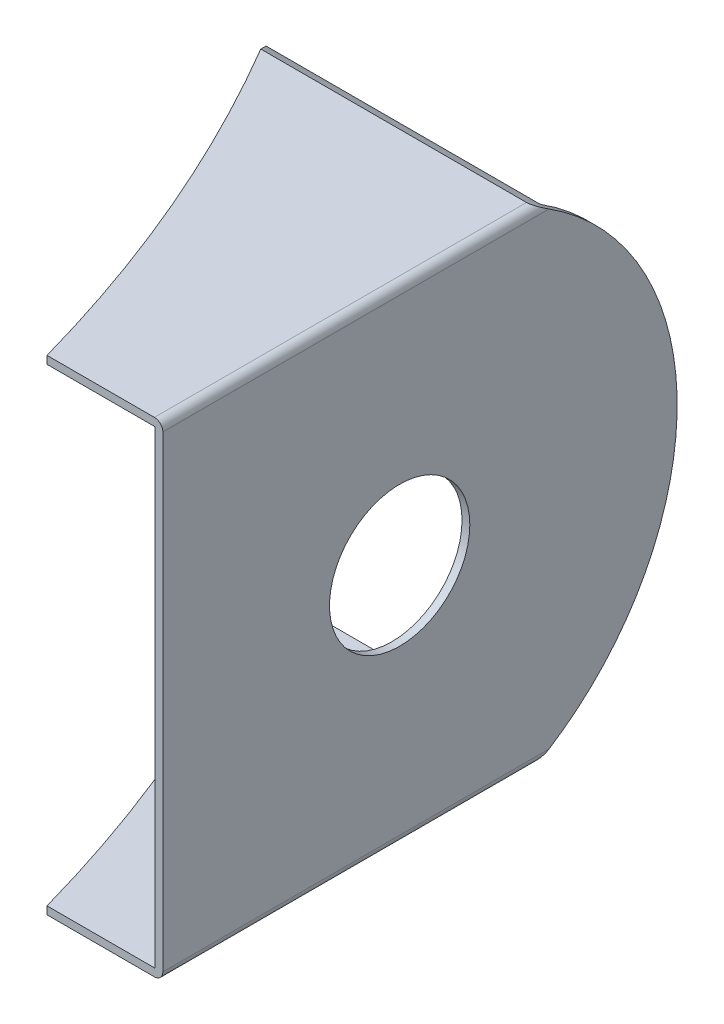
ISO-10303-21;
HEADER;
FILE_DESCRIPTION(('STEP AP214'),'2;1');
FILE_NAME('part.step','',(''),(''),'','','');
FILE_SCHEMA(('AUTOMOTIVE_DESIGN { 1 0 10303 214 1 1 1 1 }'));
ENDSEC;
DATA;
#1=APPLICATION_CONTEXT('core data for automotive mechanical design processes');
#2=APPLICATION_PROTOCOL_DEFINITION('international standard','automotive_design',2000,#1);
#3=PRODUCT_CONTEXT('',#1,'mechanical');
#4=PRODUCT('Part','Part','',(#3));
#5=PRODUCT_RELATED_PRODUCT_CATEGORY('part','',(#4));
#6=PRODUCT_DEFINITION_FORMATION('','',#4);
#7=PRODUCT_DEFINITION_CONTEXT('part definition',#1,'design');
#8=PRODUCT_DEFINITION('design','',#6,#7);
#9=PRODUCT_DEFINITION_SHAPE('','',#8);
#10=(LENGTH_UNIT() NAMED_UNIT(*) SI_UNIT(.MILLI.,.METRE.));
#11=(NAMED_UNIT(*) PLANE_ANGLE_UNIT() SI_UNIT($,.RADIAN.));
#12=(NAMED_UNIT(*) SI_UNIT($,.STERADIAN.) SOLID_ANGLE_UNIT());
#13=UNCERTAINTY_MEASURE_WITH_UNIT(LENGTH_MEASURE(1.E-05),#10,'distance_accuracy_value','');
#14=(GEOMETRIC_REPRESENTATION_CONTEXT(3) GLOBAL_UNCERTAINTY_ASSIGNED_CONTEXT((#13)) GLOBAL_UNIT_ASSIGNED_CONTEXT((#10,
#11,#12)) REPRESENTATION_CONTEXT('',''));
#15=CARTESIAN_POINT('',(0.,0.,0.));
#16=DIRECTION('',(0.,0.,1.));
#17=DIRECTION('',(1.,0.,0.));
#18=AXIS2_PLACEMENT_3D('',#15,#16,#17);
#19=CARTESIAN_POINT('',(-2.5,0.,0.));
#20=DIRECTION('',(-1.,0.,0.));
#21=DIRECTION('',(0.,0.,1.));
#22=AXIS2_PLACEMENT_3D('',#19,#20,#21);
#23=PLANE('',#22);
#24=CARTESIAN_POINT('',(-2.5,0.,-265.));
#25=DIRECTION('',(-1.,0.,0.));
#26=DIRECTION('',(0.,0.,1.));
#27=AXIS2_PLACEMENT_3D('',#24,#25,#26);
#28=CIRCLE('',#27,22.5);
#29=CARTESIAN_POINT('',(-2.5,0.,-242.5));
#30=VERTEX_POINT('',#29);
#31=EDGE_CURVE('E196',#30,#30,#28,.T.);
#32=ORIENTED_EDGE('',*,*,#31,.F.);
#33=EDGE_LOOP('',(#32));
#34=FACE_BOUND('',#33,.T.);
#35=CARTESIAN_POINT('',(-2.5,0.,-265.));
#36=DIRECTION('',(-1.,0.,0.));
#37=DIRECTION('',(0.,0.,1.));
#38=AXIS2_PLACEMENT_3D('',#35,#36,#37);
#39=CIRCLE('',#38,89.);
#40=CARTESIAN_POINT('',(-2.50000000000002,-75.,-312.916594202844));
#41=VERTEX_POINT('',#40);
#42=CARTESIAN_POINT('',(-2.5,75.,-312.916594202844));
#43=VERTEX_POINT('',#42);
#44=EDGE_CURVE('E309',#41,#43,#39,.F.);
#45=ORIENTED_EDGE('',*,*,#44,.F.);
#46=DIRECTION('',(0.,0.,-1.));
#47=VECTOR('',#46,1.);
#48=CARTESIAN_POINT('',(-2.5,-75.,365.));
#49=LINE('',#48,#47);
#50=CARTESIAN_POINT('',(-2.50000000000002,-75.,-189.039471801476));
#51=VERTEX_POINT('',#50);
#52=EDGE_CURVE('E217',#51,#41,#49,.T.);
#53=ORIENTED_EDGE('',*,*,#52,.F.);
#54=DIRECTION('',(0.,-1.,0.));
#55=VECTOR('',#54,1.);
#56=CARTESIAN_POINT('',(-2.5,0.,-189.039471801476));
#57=LINE('',#56,#55);
#58=CARTESIAN_POINT('',(-2.5,75.,-189.039471801476));
#59=VERTEX_POINT('',#58);
#60=EDGE_CURVE('E322',#59,#51,#57,.T.);
#61=ORIENTED_EDGE('',*,*,#60,.F.);
#62=DIRECTION('',(0.,0.,1.));
#63=VECTOR('',#62,1.);
#64=CARTESIAN_POINT('',(-2.5,75.,365.));
#65=LINE('',#64,#63);
#66=EDGE_CURVE('E215',#43,#59,#65,.T.);
#67=ORIENTED_EDGE('',*,*,#66,.F.);
#68=EDGE_LOOP('',(#45,#53,#61,#67));
#69=FACE_BOUND('',#68,.T.);
#70=ADVANCED_FACE('F78',(#34,#69),#23,.T.);
#71=CARTESIAN_POINT('',(0.,0.,0.));
#72=DIRECTION('',(-1.,0.,0.));
#73=DIRECTION('',(0.,0.,1.));
#74=AXIS2_PLACEMENT_3D('',#71,#72,#73);
#75=PLANE('',#74);
#76=CARTESIAN_POINT('',(0.,0.,-265.));
#77=DIRECTION('',(1.,0.,0.));
#78=DIRECTION('',(0.,0.,-1.));
#79=AXIS2_PLACEMENT_3D('',#76,#77,#78);
#80=CIRCLE('',#79,22.5);
#81=CARTESIAN_POINT('',(0.,0.,-287.5));
#82=VERTEX_POINT('',#81);
#83=EDGE_CURVE('E193',#82,#82,#80,.T.);
#84=ORIENTED_EDGE('',*,*,#83,.F.);
#85=EDGE_LOOP('',(#84));
#86=FACE_BOUND('',#85,.T.);
#87=DIRECTION('',(0.,0.,-1.));
#88=VECTOR('',#87,1.);
#89=CARTESIAN_POINT('',(0.,-75.,365.));
#90=LINE('',#89,#88);
#91=CARTESIAN_POINT('',(0.,-75.,-189.039471801476));
#92=VERTEX_POINT('',#91);
#93=CARTESIAN_POINT('',(0.,-75.,-312.916594202844));
#94=VERTEX_POINT('',#93);
#95=EDGE_CURVE('E218',#92,#94,#90,.T.);
#96=ORIENTED_EDGE('',*,*,#95,.T.);
#97=CARTESIAN_POINT('',(0.,0.,-265.));
#98=DIRECTION('',(-1.,0.,0.));
#99=DIRECTION('',(0.,0.,1.));
#100=AXIS2_PLACEMENT_3D('',#97,#98,#99);
#101=CIRCLE('',#100,89.);
#102=CARTESIAN_POINT('',(0.,75.,-312.916594202844));
#103=VERTEX_POINT('',#102);
#104=EDGE_CURVE('E226',#94,#103,#101,.F.);
#105=ORIENTED_EDGE('',*,*,#104,.T.);
#106=DIRECTION('',(0.,0.,1.));
#107=VECTOR('',#106,1.);
#108=CARTESIAN_POINT('',(0.,75.,365.));
#109=LINE('',#108,#107);
#110=CARTESIAN_POINT('',(0.,75.,-189.039471801476));
#111=VERTEX_POINT('',#110);
#112=EDGE_CURVE('E212',#103,#111,#109,.T.);
#113=ORIENTED_EDGE('',*,*,#112,.T.);
#114=DIRECTION('',(0.,-1.,0.));
#115=VECTOR('',#114,1.);
#116=CARTESIAN_POINT('',(0.,0.,-189.039471801476));
#117=LINE('',#116,#115);
#118=EDGE_CURVE('E198',#111,#92,#117,.T.);
#119=ORIENTED_EDGE('',*,*,#118,.T.);
#120=EDGE_LOOP('',(#96,#105,#113,#119));
#121=FACE_BOUND('',#120,.T.);
#122=ADVANCED_FACE('F80',(#86,#121),#75,.F.);
#123=CARTESIAN_POINT('',(-2.69999999999999,75.,-365.));
#124=DIRECTION('',(0.,0.,-1.));
#125=DIRECTION('',(0.,1.,0.));
#126=AXIS2_PLACEMENT_3D('',#123,#124,#125);
#127=CYLINDRICAL_SURFACE('',#126,2.70000000000001);
#128=CARTESIAN_POINT('',(-2.69999999999999,77.7,-308.401728076195));
#129=CARTESIAN_POINT('',(-2.65984174106869,77.7000054761132,-308.401717883849));
#130=CARTESIAN_POINT('',(-2.61970528145281,77.6991034412853,-308.403333172818));
#131=CARTESIAN_POINT('',(-2.53980520822543,77.6955387905893,-308.409714035789));
#132=CARTESIAN_POINT('',(-2.50004123564936,77.6928780963616,-308.414476171313));
#133=CARTESIAN_POINT('',(-2.38257877020894,77.6824174794397,-308.433192660789));
#134=CARTESIAN_POINT('',(-2.30577201693635,77.6721362371867,-308.451582221636));
#135=CARTESIAN_POINT('',(-2.13840998950569,77.6426315917734,-308.504285477607));
#136=CARTESIAN_POINT('',(-2.04902879567057,77.6218457699448,-308.541376779199));
#137=CARTESIAN_POINT('',(-1.87803547909733,77.5733886538341,-308.627649900219));
#138=CARTESIAN_POINT('',(-1.79646143216919,77.5456857783308,-308.676887161744));
#139=CARTESIAN_POINT('',(-1.59701187561457,77.4679108816823,-308.814746794419));
#140=CARTESIAN_POINT('',(-1.48508364540555,77.4141112449715,-308.9097812655));
#141=CARTESIAN_POINT('',(-1.27860490111391,77.2986227828171,-309.112772265397));
#142=CARTESIAN_POINT('',(-1.18409022644411,77.2369181204062,-309.220754705645));
#143=CARTESIAN_POINT('',(-1.01593601718424,77.1128214081418,-309.436777347634));
#144=CARTESIAN_POINT('',(-0.941283618400169,77.0507984876956,-309.544253999978));
#145=CARTESIAN_POINT('',(-0.802703646059008,76.9233141028206,-309.764047137146));
#146=CARTESIAN_POINT('',(-0.738785133111528,76.8578497940606,-309.876367611201));
#147=CARTESIAN_POINT('',(-0.620156558505752,76.7240279015436,-310.104779546486));
#148=CARTESIAN_POINT('',(-0.565483953343075,76.6556598897692,-310.220884176106));
#149=CARTESIAN_POINT('',(-0.464656302995641,76.5167722720493,-310.455496572402));
#150=CARTESIAN_POINT('',(-0.418503814466675,76.4462520276506,-310.574005048607));
#151=CARTESIAN_POINT('',(-0.311470271773249,76.2653583754462,-310.87636130187));
#152=CARTESIAN_POINT('',(-0.255853419959815,76.153780447872,-311.061362462463));
#153=CARTESIAN_POINT('',(-0.161279447431648,75.9273334662262,-311.433690328185));
#154=CARTESIAN_POINT('',(-0.122333637112966,75.8124622340254,-311.621018523692));
#155=CARTESIAN_POINT('',(-0.0608930546610879,75.5822711688357,-311.99326839316));
#156=CARTESIAN_POINT('',(-0.0381096888427259,75.4669981949599,-312.178171199399));
#157=CARTESIAN_POINT('',(-0.0152806223880787,75.2927502461648,-312.455386101439));
#158=CARTESIAN_POINT('',(-0.00956196895024384,75.2344821123025,-312.547708999312));
#159=CARTESIAN_POINT('',(-0.00192392878167082,75.1175346055044,-312.732252529271));
#160=CARTESIAN_POINT('',(-4.57947227559795E-06,75.0588552285237,-312.82447316034));
#161=CARTESIAN_POINT('',(0.,75.,-312.916594202844));
#162=B_SPLINE_CURVE_WITH_KNOTS('',3,(#128,#129,#130,#131,#132,#133,#134,#135,#136,#137,#138,
#139,#140,#141,#142,#143,#144,#145,#146,#147,#148,#149,#150,#151,#152,#153,#154,#155,#156,#157,
#158,#159,#160,#161),.UNSPECIFIED.,.F.,.F.,(4,2,2,2,2,2,2,2,2,2,2,2,2,2,2,2,4),(0.,
0.120392027188311,0.240652722191132,0.478401767589202,0.773717648538552,1.07040733153265,
1.53691788742706,2.0043781125079,2.43819289647311,2.87237204814082,3.30827004349671,
3.74429862815152,4.41276982819332,5.08169383358017,5.73835060599415,6.06626088806534,
6.39417439988116),.UNSPECIFIED.);
#163=CARTESIAN_POINT('',(-2.69999999999999,77.7,-308.401728076195));
#164=VERTEX_POINT('',#163);
#165=EDGE_CURVE('E240',#164,#103,#162,.T.);
#166=ORIENTED_EDGE('',*,*,#165,.F.);
#167=DIRECTION('',(0.,0.,-1.));
#168=VECTOR('',#167,1.);
#169=CARTESIAN_POINT('',(-2.69999999999999,77.7,0.));
#170=LINE('',#169,#168);
#171=CARTESIAN_POINT('',(-2.69999999999999,77.7,-189.039471801476));
#172=VERTEX_POINT('',#171);
#173=EDGE_CURVE('E210',#172,#164,#170,.T.);
#174=ORIENTED_EDGE('',*,*,#173,.F.);
#175=CARTESIAN_POINT('',(-2.69999999999999,75.,-189.039471801476));
#176=DIRECTION('',(0.,0.,-1.));
#177=DIRECTION('',(-1.,0.,0.));
#178=AXIS2_PLACEMENT_3D('',#175,#176,#177);
#179=CIRCLE('',#178,2.70000000000001);
#180=EDGE_CURVE('E192',#111,#172,#179,.F.);
#181=ORIENTED_EDGE('',*,*,#180,.F.);
#182=ORIENTED_EDGE('',*,*,#112,.F.);
#183=EDGE_LOOP('',(#166,#174,#181,#182));
#184=FACE_BOUND('',#183,.T.);
#185=ADVANCED_FACE('F287',(#184),#127,.T.);
#186=CARTESIAN_POINT('',(-2.69999999999999,75.,-365.));
#187=DIRECTION('',(0.,0.,-1.));
#188=DIRECTION('',(0.,1.,0.));
#189=AXIS2_PLACEMENT_3D('',#186,#187,#188);
#190=CYLINDRICAL_SURFACE('',#189,0.200000000000006);
#191=DIRECTION('',(0.,0.,1.));
#192=VECTOR('',#191,1.);
#193=CARTESIAN_POINT('',(-2.70000000000001,75.2,365.));
#194=LINE('',#193,#192);
#195=CARTESIAN_POINT('',(-2.7,75.2,-189.039471801476));
#196=VERTEX_POINT('',#195);
#197=CARTESIAN_POINT('',(-2.69999999999999,75.2,-312.602100793978));
#198=VERTEX_POINT('',#197);
#199=EDGE_CURVE('E208',#196,#198,#194,.F.);
#200=ORIENTED_EDGE('',*,*,#199,.T.);
#201=CARTESIAN_POINT('',(-2.69999999999999,75.2,-312.602100793978));
#202=CARTESIAN_POINT('',(-2.69356074440797,75.2000081597546,-312.602087868224));
#203=CARTESIAN_POINT('',(-2.68714055642431,75.1996894485544,-312.602591392653));
#204=CARTESIAN_POINT('',(-2.67455867211747,75.1984726704153,-312.604513548254));
#205=CARTESIAN_POINT('',(-2.66839503066849,75.1975804389451,-312.605922962146));
#206=CARTESIAN_POINT('',(-2.65507803315628,75.1950333782778,-312.60994603715));
#207=CARTESIAN_POINT('',(-2.64800964799402,75.1932530330245,-312.61275788283));
#208=CARTESIAN_POINT('',(-2.63449025806675,75.1890998537107,-312.619316232223));
#209=CARTESIAN_POINT('',(-2.62804191392264,75.1867246113549,-312.623066534994));
#210=CARTESIAN_POINT('',(-2.61271343341617,75.180225706199,-312.633325679449));
#211=CARTESIAN_POINT('',(-2.60424696089279,75.1758243962924,-312.640271859968));
#212=CARTESIAN_POINT('',(-2.58865954876164,75.1663923286703,-312.65515232309));
#213=CARTESIAN_POINT('',(-2.58154112879144,75.1613604209051,-312.663088410904));
#214=CARTESIAN_POINT('',(-2.56358560665339,75.1469889522152,-312.685745663265));
#215=CARTESIAN_POINT('',(-2.55392106470705,75.1372293574547,-312.701122776083));
#216=CARTESIAN_POINT('',(-2.53729377265146,75.1170376674919,-312.732913295105));
#217=CARTESIAN_POINT('',(-2.53034477498696,75.1066024533928,-312.749331498938));
#218=CARTESIAN_POINT('',(-2.52025623972902,75.088155668948,-312.778332866958));
#219=CARTESIAN_POINT('',(-2.51659556886052,75.0802265551514,-312.790792020566));
#220=CARTESIAN_POINT('',(-2.51040050699822,75.0642313029192,-312.815911585961));
#221=CARTESIAN_POINT('',(-2.50786689376081,75.0561650738365,-312.828572130503));
#222=CARTESIAN_POINT('',(-2.50388851599764,75.040095804099,-312.853779797852));
#223=CARTESIAN_POINT('',(-2.50242523105904,75.0320941813387,-312.86632494786));
#224=CARTESIAN_POINT('',(-2.50048416425696,75.0160623709561,-312.891446095826));
#225=CARTESIAN_POINT('',(-2.50000485825316,75.00803224684,-312.904022015821));
#226=CARTESIAN_POINT('',(-2.49999999999999,75.,-312.916594202844));
#227=B_SPLINE_CURVE_WITH_KNOTS('',3,(#201,#202,#203,#204,#205,#206,#207,#208,#209,#210,#211,
#212,#213,#214,#215,#216,#217,#218,#219,#220,#221,#222,#223,#224,#225,#226),.UNSPECIFIED.,.F.,
.F.,(4,2,2,2,2,2,2,2,2,2,2,2,4),(0.,0.0192593530396677,0.0383257824187712,0.0616349667844509,
0.0850400825910045,0.120248878276495,0.155522846677881,0.217035299640851,0.278855356017721,
0.324455511713961,0.370087086392449,0.414909084578551,0.459661602905175),.UNSPECIFIED.);
#228=EDGE_CURVE('E274',#198,#43,#227,.T.);
#229=ORIENTED_EDGE('',*,*,#228,.T.);
#230=ORIENTED_EDGE('',*,*,#66,.T.);
#231=CARTESIAN_POINT('',(-2.69999999999999,75.,-189.039471801476));
#232=DIRECTION('',(0.,0.,-1.));
#233=DIRECTION('',(-1.,0.,0.));
#234=AXIS2_PLACEMENT_3D('',#231,#232,#233);
#235=CIRCLE('',#234,0.200000000000006);
#236=EDGE_CURVE('E325',#59,#196,#235,.F.);
#237=ORIENTED_EDGE('',*,*,#236,.T.);
#238=EDGE_LOOP('',(#200,#229,#230,#237));
#239=FACE_BOUND('',#238,.T.);
#240=ADVANCED_FACE('F291',(#239),#190,.F.);
#241=CARTESIAN_POINT('',(2.69957650317733E-13,77.7,0.));
#242=DIRECTION('',(0.,1.,0.));
#243=DIRECTION('',(-1.,0.,0.));
#244=AXIS2_PLACEMENT_3D('',#241,#242,#243);
#245=PLANE('',#244);
#246=CARTESIAN_POINT('',(-520.130598813427,77.7000000000018,-54.000000000002));
#247=DIRECTION('',(0.,1.,0.));
#248=DIRECTION('',(-1.,0.,0.));
#249=AXIS2_PLACEMENT_3D('',#246,#247,#248);
#250=CIRCLE('',#249,501.5);
#251=CARTESIAN_POINT('',(-37.1537970355586,77.7000000000001,-189.039471801476));
#252=VERTEX_POINT('',#251);
#253=CARTESIAN_POINT('',(-87.9477546932022,77.7000000000004,-308.401728076195));
#254=VERTEX_POINT('',#253);
#255=EDGE_CURVE('E106',#252,#254,#250,.T.);
#256=ORIENTED_EDGE('',*,*,#255,.F.);
#257=DIRECTION('',(-1.,0.,0.));
#258=VECTOR('',#257,1.);
#259=CARTESIAN_POINT('',(2.69957650317733E-13,77.7,-189.039471801476));
#260=LINE('',#259,#258);
#261=EDGE_CURVE('E184',#172,#252,#260,.T.);
#262=ORIENTED_EDGE('',*,*,#261,.F.);
#263=ORIENTED_EDGE('',*,*,#173,.T.);
#264=DIRECTION('',(1.,0.,0.));
#265=VECTOR('',#264,1.);
#266=CARTESIAN_POINT('',(-130.,77.7000000000004,-308.401728076195));
#267=LINE('',#266,#265);
#268=EDGE_CURVE('E186',#254,#164,#267,.T.);
#269=ORIENTED_EDGE('',*,*,#268,.F.);
#270=EDGE_LOOP('',(#256,#262,#263,#269));
#271=FACE_BOUND('',#270,.T.);
#272=ADVANCED_FACE('F182',(#271),#245,.T.);
#273=CARTESIAN_POINT('',(2.61228946970625E-13,75.2,0.));
#274=DIRECTION('',(0.,1.,0.));
#275=DIRECTION('',(-1.,0.,0.));
#276=AXIS2_PLACEMENT_3D('',#273,#274,#275);
#277=PLANE('',#276);
#278=DIRECTION('',(-1.,0.,0.));
#279=VECTOR('',#278,1.);
#280=CARTESIAN_POINT('',(2.61228946970625E-13,75.2,-189.039471801476));
#281=LINE('',#280,#279);
#282=CARTESIAN_POINT('',(-37.1537970355586,75.2000000000001,-189.039471801476));
#283=VERTEX_POINT('',#282);
#284=EDGE_CURVE('E330',#196,#283,#281,.T.);
#285=ORIENTED_EDGE('',*,*,#284,.T.);
#286=CARTESIAN_POINT('',(-520.130598813427,75.2000000000018,-54.000000000002));
#287=DIRECTION('',(0.,1.,0.));
#288=DIRECTION('',(-1.,0.,0.));
#289=AXIS2_PLACEMENT_3D('',#286,#287,#288);
#290=CIRCLE('',#289,501.5);
#291=CARTESIAN_POINT('',(-90.4479211721909,75.2000000000004,-312.602100793977));
#292=VERTEX_POINT('',#291);
#293=EDGE_CURVE('E173',#283,#292,#290,.T.);
#294=ORIENTED_EDGE('',*,*,#293,.T.);
#295=DIRECTION('',(1.,0.,0.));
#296=VECTOR('',#295,1.);
#297=CARTESIAN_POINT('',(-130.,75.2000000000004,-312.602100793977));
#298=LINE('',#297,#296);
#299=EDGE_CURVE('E242',#292,#198,#298,.T.);
#300=ORIENTED_EDGE('',*,*,#299,.T.);
#301=ORIENTED_EDGE('',*,*,#199,.F.);
#302=EDGE_LOOP('',(#285,#294,#300,#301));
#303=FACE_BOUND('',#302,.T.);
#304=ADVANCED_FACE('F293',(#303),#277,.F.);
#305=CARTESIAN_POINT('',(-2.70000000000002,-75.,365.));
#306=DIRECTION('',(0.,0.,1.));
#307=DIRECTION('',(0.,-1.,0.));
#308=AXIS2_PLACEMENT_3D('',#305,#306,#307);
#309=CYLINDRICAL_SURFACE('',#308,2.70000000000001);
#310=CARTESIAN_POINT('',(0.,-75.,-312.916594202844));
#311=CARTESIAN_POINT('',(-5.48315406733443E-06,-75.0615534313284,-312.820249925329));
#312=CARTESIAN_POINT('',(-0.00210431795436465,-75.122913952728,-312.723797557342));
#313=CARTESIAN_POINT('',(-0.0104562440630518,-75.2451842713042,-312.530782576569));
#314=CARTESIAN_POINT('',(-0.0167094666221996,-75.3060940541792,-312.434219960396));
#315=CARTESIAN_POINT('',(-0.0416787173237319,-75.488240162083,-312.144222668999));
#316=CARTESIAN_POINT('',(-0.0666041220879811,-75.6086938358383,-311.950790694987));
#317=CARTESIAN_POINT('',(-0.133105592482795,-75.8462911155908,-311.565986057194));
#318=CARTESIAN_POINT('',(-0.174607486245809,-75.9634470106966,-311.374608068388));
#319=CARTESIAN_POINT('',(-0.275186663854188,-76.1942049589935,-310.994482796744));
#320=CARTESIAN_POINT('',(-0.334247367463908,-76.307810253563,-310.805733207225));
#321=CARTESIAN_POINT('',(-0.430480944116539,-76.4635568188196,-310.544835238964));
#322=CARTESIAN_POINT('',(-0.459480841092596,-76.507620544854,-310.470774343927));
#323=CARTESIAN_POINT('',(-0.520769433258584,-76.5949287880894,-310.323550301138));
#324=CARTESIAN_POINT('',(-0.553057851111653,-76.6381733740083,-310.250387078262));
#325=CARTESIAN_POINT('',(-0.655437985567025,-76.7668763192897,-310.031935992275));
#326=CARTESIAN_POINT('',(-0.730844021815753,-76.8509727575857,-309.888241659646));
#327=CARTESIAN_POINT('',(-0.866564745573287,-76.9833798717041,-309.660603317542));
#328=CARTESIAN_POINT('',(-0.92185820430153,-77.033233679171,-309.574548753646));
#329=CARTESIAN_POINT('',(-1.03968524628489,-77.1305406389732,-309.405958594687));
#330=CARTESIAN_POINT('',(-1.10222325104569,-77.1779922995707,-309.323425191153));
#331=CARTESIAN_POINT('',(-1.23510674144134,-77.269484805367,-309.163731030463));
#332=CARTESIAN_POINT('',(-1.3054069686753,-77.3135431191499,-309.086542997064));
#333=CARTESIAN_POINT('',(-1.45511835627923,-77.3974199950886,-308.939123103068));
#334=CARTESIAN_POINT('',(-1.53451386478099,-77.437245620045,-308.868879668609));
#335=CARTESIAN_POINT('',(-1.68909308922567,-77.5047750414191,-308.749442574968));
#336=CARTESIAN_POINT('',(-1.76266730069061,-77.5333865948939,-308.698704452017));
#337=CARTESIAN_POINT('',(-1.91724564234332,-77.5853340005456,-308.606407201778));
#338=CARTESIAN_POINT('',(-1.9982528637253,-77.6086676436716,-308.564851918102));
#339=CARTESIAN_POINT('',(-2.16853832368213,-77.6486316631693,-308.493582556169));
#340=CARTESIAN_POINT('',(-2.2579169402792,-77.665163054478,-308.464043400064));
#341=CARTESIAN_POINT('',(-2.39546994532592,-77.6831717589383,-308.43184279697));
#342=CARTESIAN_POINT('',(-2.44184168031941,-77.6880413985335,-308.423130643608));
#343=CARTESIAN_POINT('',(-2.53536496341074,-77.6953818428264,-308.409995418962));
#344=CARTESIAN_POINT('',(-2.58251587744709,-77.6978545089019,-308.405569019563));
#345=CARTESIAN_POINT('',(-2.65317358667668,-77.6996966159089,-308.402271161887));
#346=CARTESIAN_POINT('',(-2.67658943419555,-77.7000027594894,-308.40172300444));
#347=CARTESIAN_POINT('',(-2.70000000000001,-77.7,-308.401728076195));
#348=B_SPLINE_CURVE_WITH_KNOTS('',3,(#310,#311,#312,#313,#314,#315,#316,#317,#318,#319,#320,
#321,#322,#323,#324,#325,#326,#327,#328,#329,#330,#331,#332,#333,#334,#335,#336,#337,#338,#339,
#340,#341,#342,#343,#344,#345,#346,#347),.UNSPECIFIED.,.F.,.F.,(4,2,2,2,2,2,2,2,2,2,2,2,2,2,2,2,
2,2,4),(0.,0.342941922447976,0.685894680073237,1.37290877849785,2.05688265066433,
2.74021270797353,3.01293409410221,3.28563249933316,3.83305397194942,4.1741856198769,
4.51552657588798,4.85497306730471,5.19384394777077,5.47464815793366,5.75556968112398,
6.04044571129364,6.18252906909512,6.32450200298501,6.39473975055716),.UNSPECIFIED.);
#349=CARTESIAN_POINT('',(-2.70000000000001,-77.7000000000004,-308.401728076195));
#350=VERTEX_POINT('',#349);
#351=EDGE_CURVE('E235',#94,#350,#348,.T.);
#352=ORIENTED_EDGE('',*,*,#351,.F.);
#353=ORIENTED_EDGE('',*,*,#95,.F.);
#354=CARTESIAN_POINT('',(-2.70000000000002,-75.,-189.039471801476));
#355=DIRECTION('',(0.,0.,-1.));
#356=DIRECTION('',(-1.,0.,0.));
#357=AXIS2_PLACEMENT_3D('',#354,#355,#356);
#358=CIRCLE('',#357,2.70000000000001);
#359=CARTESIAN_POINT('',(-2.7,-77.7,-189.039471801476));
#360=VERTEX_POINT('',#359);
#361=EDGE_CURVE('E232',#360,#92,#358,.F.);
#362=ORIENTED_EDGE('',*,*,#361,.F.);
#363=DIRECTION('',(0.,0.,1.));
#364=VECTOR('',#363,1.);
#365=CARTESIAN_POINT('',(-2.7,-77.7,-365.));
#366=LINE('',#365,#364);
#367=EDGE_CURVE('E205',#360,#350,#366,.F.);
#368=ORIENTED_EDGE('',*,*,#367,.T.);
#369=EDGE_LOOP('',(#352,#353,#362,#368));
#370=FACE_BOUND('',#369,.T.);
#371=ADVANCED_FACE('F231',(#370),#309,.T.);
#372=CARTESIAN_POINT('',(-2.70000000000002,-75.,365.));
#373=DIRECTION('',(0.,0.,1.));
#374=DIRECTION('',(0.,-1.,0.));
#375=AXIS2_PLACEMENT_3D('',#372,#373,#374);
#376=CYLINDRICAL_SURFACE('',#375,0.200000000000006);
#377=ORIENTED_EDGE('',*,*,#52,.T.);
#378=CARTESIAN_POINT('',(-2.50000000000002,-75.,-312.916594202844));
#379=CARTESIAN_POINT('',(-2.50000814912922,-75.0090840001549,-312.902375823492));
#380=CARTESIAN_POINT('',(-2.50061950746852,-75.0181663468577,-312.888150968514));
#381=CARTESIAN_POINT('',(-2.50310586748239,-75.0362985743765,-312.859734424288));
#382=CARTESIAN_POINT('',(-2.50498448774922,-75.0453482874082,-312.84554294712));
#383=CARTESIAN_POINT('',(-2.51007460955225,-75.0633738417529,-312.81725829119));
#384=CARTESIAN_POINT('',(-2.51329207384104,-75.0723491670526,-312.803165842635));
#385=CARTESIAN_POINT('',(-2.52117927184258,-75.0900971410082,-312.775282140062));
#386=CARTESIAN_POINT('',(-2.52584695948389,-75.0988700566201,-312.761490490813));
#387=CARTESIAN_POINT('',(-2.53547249033267,-75.1139724922818,-312.737734370018));
#388=CARTESIAN_POINT('',(-2.54007224556964,-75.1203691015468,-312.727667899897));
#389=CARTESIAN_POINT('',(-2.55033486852539,-75.1329138331611,-312.707917535215));
#390=CARTESIAN_POINT('',(-2.55599788639378,-75.1390619202658,-312.698233694922));
#391=CARTESIAN_POINT('',(-2.56860406291956,-75.1510344785914,-312.679368101461));
#392=CARTESIAN_POINT('',(-2.57555693181496,-75.1568560270035,-312.670190891967));
#393=CARTESIAN_POINT('',(-2.59093439630727,-75.1679111215306,-312.652756931437));
#394=CARTESIAN_POINT('',(-2.59935534585359,-75.1731460727819,-312.644497981187));
#395=CARTESIAN_POINT('',(-2.61412385041696,-75.1807299251493,-312.632529600968));
#396=CARTESIAN_POINT('',(-2.61991956374032,-75.18338605653,-312.628336962936));
#397=CARTESIAN_POINT('',(-2.63214561638514,-75.1882525977177,-312.620654047139));
#398=CARTESIAN_POINT('',(-2.63857612406581,-75.190462888804,-312.617163956453));
#399=CARTESIAN_POINT('',(-2.65212699644402,-75.1943152286945,-312.611080333546));
#400=CARTESIAN_POINT('',(-2.65925534298858,-75.1959493961739,-312.60849923676));
#401=CARTESIAN_POINT('',(-2.67396606121457,-75.1984369927653,-312.604569943383));
#402=CARTESIAN_POINT('',(-2.68154657875856,-75.1992934042232,-312.603217037237));
#403=CARTESIAN_POINT('',(-2.69099093581041,-75.1998052488306,-312.602408453007));
#404=CARTESIAN_POINT('',(-2.69279034541177,-75.1998782112942,-312.602293190549));
#405=CARTESIAN_POINT('',(-2.69639289368694,-75.1999755091003,-312.602139484008));
#406=CARTESIAN_POINT('',(-2.69819603016305,-75.1999998677061,-312.602101003174));
#407=CARTESIAN_POINT('',(-2.70000000000002,-75.2,-312.602100793978));
#408=B_SPLINE_CURVE_WITH_KNOTS('',3,(#378,#379,#380,#381,#382,#383,#384,#385,#386,#387,#388,
#389,#390,#391,#392,#393,#394,#395,#396,#397,#398,#399,#400,#401,#402,#403,#404,#405,#406,#407),
.UNSPECIFIED.,.F.,.F.,(4,2,2,2,2,2,2,2,2,2,2,2,2,2,4),(0.,0.0506140218710687,0.101373184347036,
0.152360872170664,0.203276947361266,0.241584454468244,0.279897375279042,0.318511377440862,
0.357030811568396,0.379866462112315,0.40270818544925,0.425851252046133,0.448905195974393,
0.454317464326197,0.459727141578067),.UNSPECIFIED.);
#409=CARTESIAN_POINT('',(-2.70000000000001,-75.2000000000004,-312.602100793977));
#410=VERTEX_POINT('',#409);
#411=EDGE_CURVE('E264',#41,#410,#408,.T.);
#412=ORIENTED_EDGE('',*,*,#411,.T.);
#413=DIRECTION('',(0.,0.,1.));
#414=VECTOR('',#413,1.);
#415=CARTESIAN_POINT('',(-2.70000000000001,-75.2,-365.));
#416=LINE('',#415,#414);
#417=CARTESIAN_POINT('',(-2.70000000000001,-75.2,-189.039471801476));
#418=VERTEX_POINT('',#417);
#419=EDGE_CURVE('E204',#410,#418,#416,.T.);
#420=ORIENTED_EDGE('',*,*,#419,.T.);
#421=CARTESIAN_POINT('',(-2.70000000000002,-75.,-189.039471801476));
#422=DIRECTION('',(0.,0.,-1.));
#423=DIRECTION('',(-1.,0.,0.));
#424=AXIS2_PLACEMENT_3D('',#421,#422,#423);
#425=CIRCLE('',#424,0.200000000000006);
#426=EDGE_CURVE('E319',#418,#51,#425,.F.);
#427=ORIENTED_EDGE('',*,*,#426,.T.);
#428=EDGE_LOOP('',(#377,#412,#420,#427));
#429=FACE_BOUND('',#428,.T.);
#430=ADVANCED_FACE('F316',(#429),#376,.F.);
#431=CARTESIAN_POINT('',(2.69957650317733E-13,-77.7,0.));
#432=DIRECTION('',(0.,1.,0.));
#433=DIRECTION('',(-1.,0.,0.));
#434=AXIS2_PLACEMENT_3D('',#431,#432,#433);
#435=PLANE('',#434);
#436=DIRECTION('',(-1.,0.,0.));
#437=VECTOR('',#436,1.);
#438=CARTESIAN_POINT('',(2.69957650317733E-13,-77.7,-189.039471801476));
#439=LINE('',#438,#437);
#440=CARTESIAN_POINT('',(-37.1537970355592,-77.7000000000008,-189.039471801476));
#441=VERTEX_POINT('',#440);
#442=EDGE_CURVE('E332',#360,#441,#439,.T.);
#443=ORIENTED_EDGE('',*,*,#442,.T.);
#444=CARTESIAN_POINT('',(-520.130598813428,-77.6999999999991,-54.000000000002));
#445=DIRECTION('',(0.,1.,0.));
#446=DIRECTION('',(-1.,0.,0.));
#447=AXIS2_PLACEMENT_3D('',#444,#445,#446);
#448=CIRCLE('',#447,501.5);
#449=CARTESIAN_POINT('',(-87.9477546932027,-77.6999999999991,-308.401728076195));
#450=VERTEX_POINT('',#449);
#451=EDGE_CURVE('E187',#441,#450,#448,.T.);
#452=ORIENTED_EDGE('',*,*,#451,.T.);
#453=DIRECTION('',(1.,0.,0.));
#454=VECTOR('',#453,1.);
#455=CARTESIAN_POINT('',(-130.,-77.7000000000004,-308.401728076195));
#456=LINE('',#455,#454);
#457=EDGE_CURVE('E238',#450,#350,#456,.T.);
#458=ORIENTED_EDGE('',*,*,#457,.T.);
#459=ORIENTED_EDGE('',*,*,#367,.F.);
#460=EDGE_LOOP('',(#443,#452,#458,#459));
#461=FACE_BOUND('',#460,.T.);
#462=ADVANCED_FACE('F338',(#461),#435,.F.);
#463=CARTESIAN_POINT('',(2.61228946970625E-13,-75.2,0.));
#464=DIRECTION('',(0.,1.,0.));
#465=DIRECTION('',(-1.,0.,0.));
#466=AXIS2_PLACEMENT_3D('',#463,#464,#465);
#467=PLANE('',#466);
#468=CARTESIAN_POINT('',(-520.130598813428,-75.2000000000018,-54.000000000002));
#469=DIRECTION('',(0.,1.,0.));
#470=DIRECTION('',(-1.,0.,0.));
#471=AXIS2_PLACEMENT_3D('',#468,#469,#470);
#472=CIRCLE('',#471,501.5);
#473=CARTESIAN_POINT('',(-37.1537970355592,-75.2000000000001,-189.039471801476));
#474=VERTEX_POINT('',#473);
#475=CARTESIAN_POINT('',(-90.4479211721915,-75.2000000000004,-312.602100793977));
#476=VERTEX_POINT('',#475);
#477=EDGE_CURVE('E99',#474,#476,#472,.T.);
#478=ORIENTED_EDGE('',*,*,#477,.F.);
#479=DIRECTION('',(-1.,0.,0.));
#480=VECTOR('',#479,1.);
#481=CARTESIAN_POINT('',(2.61228946970625E-13,-75.2,-189.039471801476));
#482=LINE('',#481,#480);
#483=EDGE_CURVE('E323',#418,#474,#482,.T.);
#484=ORIENTED_EDGE('',*,*,#483,.F.);
#485=ORIENTED_EDGE('',*,*,#419,.F.);
#486=DIRECTION('',(1.,0.,0.));
#487=VECTOR('',#486,1.);
#488=CARTESIAN_POINT('',(-130.,-75.2000000000004,-312.602100793977));
#489=LINE('',#488,#487);
#490=EDGE_CURVE('E340',#476,#410,#489,.T.);
#491=ORIENTED_EDGE('',*,*,#490,.F.);
#492=EDGE_LOOP('',(#478,#484,#485,#491));
#493=FACE_BOUND('',#492,.T.);
#494=ADVANCED_FACE('F342',(#493),#467,.T.);
#495=CARTESIAN_POINT('',(-10.,0.,-265.));
#496=DIRECTION('',(1.,0.,0.));
#497=DIRECTION('',(0.,0.,-1.));
#498=AXIS2_PLACEMENT_3D('',#495,#496,#497);
#499=CYLINDRICAL_SURFACE('',#498,22.5);
#500=ORIENTED_EDGE('',*,*,#31,.T.);
#501=EDGE_LOOP('',(#500));
#502=FACE_BOUND('',#501,.T.);
#503=ORIENTED_EDGE('',*,*,#83,.T.);
#504=EDGE_LOOP('',(#503));
#505=FACE_BOUND('',#504,.T.);
#506=ADVANCED_FACE('F367',(#502,#505),#499,.F.);
#507=CARTESIAN_POINT('',(-130.,122.559083392823,-189.039471801476));
#508=DIRECTION('',(0.,0.,-1.));
#509=DIRECTION('',(-1.,0.,0.));
#510=AXIS2_PLACEMENT_3D('',#507,#508,#509);
#511=PLANE('',#510);
#512=ORIENTED_EDGE('',*,*,#261,.T.);
#513=DIRECTION('',(0.,1.,0.));
#514=VECTOR('',#513,1.);
#515=CARTESIAN_POINT('',(-37.1537970355592,-77.7000000000008,-189.039471801476));
#516=LINE('',#515,#514);
#517=EDGE_CURVE('E170',#252,#283,#516,.F.);
#518=ORIENTED_EDGE('',*,*,#517,.T.);
#519=ORIENTED_EDGE('',*,*,#284,.F.);
#520=ORIENTED_EDGE('',*,*,#236,.F.);
#521=ORIENTED_EDGE('',*,*,#60,.T.);
#522=ORIENTED_EDGE('',*,*,#426,.F.);
#523=ORIENTED_EDGE('',*,*,#483,.T.);
#524=EDGE_CURVE('E178',#474,#441,#516,.F.);
#525=ORIENTED_EDGE('',*,*,#524,.T.);
#526=ORIENTED_EDGE('',*,*,#442,.F.);
#527=ORIENTED_EDGE('',*,*,#361,.T.);
#528=ORIENTED_EDGE('',*,*,#118,.F.);
#529=ORIENTED_EDGE('',*,*,#180,.T.);
#530=EDGE_LOOP('',(#512,#518,#519,#520,#521,#522,#523,#525,#526,#527,#528,#529));
#531=FACE_BOUND('',#530,.T.);
#532=ADVANCED_FACE('F189',(#531),#511,.F.);
#533=CARTESIAN_POINT('',(-130.,0.,-265.));
#534=DIRECTION('',(1.,0.,0.));
#535=DIRECTION('',(0.,0.,-1.));
#536=AXIS2_PLACEMENT_3D('',#533,#534,#535);
#537=CYLINDRICAL_SURFACE('',#536,89.);
#538=ORIENTED_EDGE('',*,*,#457,.F.);
#539=CARTESIAN_POINT('',(-87.9477546932027,-77.7000000000005,-308.401728076195));
#540=CARTESIAN_POINT('',(-88.6176929136258,-77.064256911819,-309.539851747374));
#541=CARTESIAN_POINT('',(-89.2859389210406,-76.4030934484574,-310.664779103934));
#542=CARTESIAN_POINT('',(-90.6173709543482,-75.0304723901402,-312.886678059775));
#543=CARTESIAN_POINT('',(-91.2805567538163,-74.3190125590701,-313.983648413168));
#544=CARTESIAN_POINT('',(-92.6006315353015,-72.8458455939483,-316.148786518988));
#545=CARTESIAN_POINT('',(-93.2575153797707,-72.0841008922296,-317.21693187754));
#546=CARTESIAN_POINT('',(-94.5625782628536,-70.5114951949618,-319.321774593546));
#547=CARTESIAN_POINT('',(-95.2107574071682,-69.7006347964834,-320.358472333061));
#548=CARTESIAN_POINT('',(-97.1476022905911,-67.1845188426715,-323.43184270301));
#549=CARTESIAN_POINT('',(-98.4203923253402,-65.4048171865368,-325.418403338842));
#550=CARTESIAN_POINT('',(-100.905619393575,-61.6538971787831,-329.241466325652));
#551=CARTESIAN_POINT('',(-102.11807649508,-59.6827431610286,-331.078018704726));
#552=CARTESIAN_POINT('',(-104.285340414808,-55.8685099053375,-334.317983926181));
#553=CARTESIAN_POINT('',(-105.251279555777,-54.0515808319068,-335.744782049917));
#554=CARTESIAN_POINT('',(-107.113580767596,-50.2879595323587,-338.467770512732));
#555=CARTESIAN_POINT('',(-108.00994363035,-48.3412687836364,-339.763962338401));
#556=CARTESIAN_POINT('',(-109.290410397548,-45.3318953254839,-341.598931124513));
#557=CARTESIAN_POINT('',(-109.706107590946,-44.3151130441641,-342.191742648521));
#558=CARTESIAN_POINT('',(-110.514840177047,-42.2519527070802,-343.340064797172));
#559=CARTESIAN_POINT('',(-110.907878008688,-41.2055778546487,-343.895579437324));
#560=CARTESIAN_POINT('',(-111.669434076782,-39.0844089857476,-344.967625909802));
#561=CARTESIAN_POINT('',(-112.037953676273,-38.0096165537427,-345.484159909389));
#562=CARTESIAN_POINT('',(-112.748626486254,-35.8329052764278,-346.476582154161));
#563=CARTESIAN_POINT('',(-113.090780835362,-34.7309876052719,-346.952472154709));
#564=CARTESIAN_POINT('',(-113.697810837338,-32.6682652710045,-347.793918022068));
#565=CARTESIAN_POINT('',(-113.966592219643,-31.7109938569532,-348.165332325468));
#566=CARTESIAN_POINT('',(-114.482608136769,-29.7790541989585,-348.876500728671));
#567=CARTESIAN_POINT('',(-114.7298433523,-28.80438650579,-349.21625582871));
#568=CARTESIAN_POINT('',(-115.201668237602,-26.8388776979317,-349.86309580465));
#569=CARTESIAN_POINT('',(-115.426258371958,-25.8480369155338,-350.170181350807));
#570=CARTESIAN_POINT('',(-115.851728313651,-23.8516046592523,-350.750693990243));
#571=CARTESIAN_POINT('',(-116.052610259135,-22.8460145247652,-351.024124118868));
#572=CARTESIAN_POINT('',(-116.42969517173,-20.8215089415902,-351.536437407561));
#573=CARTESIAN_POINT('',(-116.605898680463,-19.802593785885,-351.775321325823));
#574=CARTESIAN_POINT('',(-116.932710283885,-17.7531428585608,-352.217686134557));
#575=CARTESIAN_POINT('',(-117.083320994733,-16.7226082862048,-352.421170643695));
#576=CARTESIAN_POINT('',(-117.358182320172,-14.6514325246421,-352.792041081959));
#577=CARTESIAN_POINT('',(-117.482429640315,-13.610790089299,-352.95942249958));
#578=CARTESIAN_POINT('',(-117.703843593043,-11.5214928842915,-353.257399491254));
#579=CARTESIAN_POINT('',(-117.801013010296,-10.4728389499275,-353.387998847959));
#580=CARTESIAN_POINT('',(-117.968013458888,-8.3658873939959,-353.612290422715));
#581=CARTESIAN_POINT('',(-118.037752968173,-7.30756934413027,-353.705859091285));
#582=CARTESIAN_POINT('',(-118.1490230616,-5.1868883433346,-353.855084044046));
#583=CARTESIAN_POINT('',(-118.190556456253,-4.12452580601592,-353.910744105524));
#584=CARTESIAN_POINT('',(-118.245181965723,-1.99769836991825,-353.983939263999));
#585=CARTESIAN_POINT('',(-118.258272537146,-0.933233360189524,-354.001472292109));
#586=CARTESIAN_POINT('',(-118.255930042974,1.19560805311656,-353.998334335653));
#587=CARTESIAN_POINT('',(-118.240496999391,2.25998445676166,-353.97766338057));
#588=CARTESIAN_POINT('',(-118.181199370399,4.38650465296428,-353.898203960996));
#589=CARTESIAN_POINT('',(-118.137335141645,5.44864847336077,-353.839415974666));
#590=CARTESIAN_POINT('',(-118.021428088864,7.56872346626812,-353.683957212636));
#591=CARTESIAN_POINT('',(-117.949382380524,8.6266541963789,-353.587282559317));
#592=CARTESIAN_POINT('',(-117.777542543617,10.7360100760659,-353.35645774333));
#593=CARTESIAN_POINT('',(-117.677751962578,11.7874360397995,-353.222312371751));
#594=CARTESIAN_POINT('',(-117.450974829982,13.8820553507657,-352.9170563445));
#595=CARTESIAN_POINT('',(-117.323985700509,14.9252479078998,-352.745942184862));
#596=CARTESIAN_POINT('',(-117.050888530328,16.9468919401126,-352.377356575116));
#597=CARTESIAN_POINT('',(-116.906134977605,17.925866012592,-352.181741515052));
#598=CARTESIAN_POINT('',(-116.593535721642,19.8732446125221,-351.758556391912));
#599=CARTESIAN_POINT('',(-116.425688040444,20.8416482269622,-351.530983591698));
#600=CARTESIAN_POINT('',(-116.067709072783,22.7662838214038,-351.044646966369));
#601=CARTESIAN_POINT('',(-115.877580954963,23.7225175107763,-350.78588757635));
#602=CARTESIAN_POINT('',(-115.475869881648,25.621694255431,-350.23793756284));
#603=CARTESIAN_POINT('',(-115.264285059555,26.5646361462686,-349.948744291709));
#604=CARTESIAN_POINT('',(-114.598760511534,29.3713315509846,-349.03685404835));
#605=CARTESIAN_POINT('',(-114.113926750666,31.2136164667919,-348.369678773858));
#606=CARTESIAN_POINT('',(-113.069694074959,34.8318440930482,-346.923990613952));
#607=CARTESIAN_POINT('',(-112.510290768752,36.6077828885107,-346.145471171331));
#608=CARTESIAN_POINT('',(-111.271089391626,40.2446141172339,-344.409003628238));
#609=CARTESIAN_POINT('',(-110.584977351144,42.0986507530502,-343.441193711769));
#610=CARTESIAN_POINT('',(-109.143582737011,45.7138911362869,-341.390836201422));
#611=CARTESIAN_POINT('',(-108.388296877849,47.4750904679974,-340.308283157267));
#612=CARTESIAN_POINT('',(-106.817087856902,50.9025219094919,-338.035390092487));
#613=CARTESIAN_POINT('',(-106.001070779055,52.5685995836916,-336.844882480564));
#614=CARTESIAN_POINT('',(-104.318691245079,55.7990987589455,-334.365747275084));
#615=CARTESIAN_POINT('',(-103.452326209308,57.3635150425344,-333.077114652917));
#616=CARTESIAN_POINT('',(-101.438965617912,60.7949369918329,-330.050172816904));
#617=CARTESIAN_POINT('',(-100.279188464224,62.6300871563793,-328.284169637182));
#618=CARTESIAN_POINT('',(-97.9079214528809,66.1279727969579,-324.619703360266));
#619=CARTESIAN_POINT('',(-96.6964140883859,67.7906492400363,-322.721195279828));
#620=CARTESIAN_POINT('',(-94.8539755131626,70.1485454715194,-319.788210567299));
#621=CARTESIAN_POINT('',(-94.2367458945784,70.9105972445881,-318.798169555421));
#622=CARTESIAN_POINT('',(-92.9946886831183,72.3903068613025,-316.789949484694));
#623=CARTESIAN_POINT('',(-92.3698610007595,73.1079641815043,-315.771770094277));
#624=CARTESIAN_POINT('',(-91.1146508366572,74.4978545880255,-313.709495809653));
#625=CARTESIAN_POINT('',(-90.4842724201636,75.1701182244961,-312.665419004813));
#626=CARTESIAN_POINT('',(-89.2190238886738,76.4692333910724,-310.552106394878));
#627=CARTESIAN_POINT('',(-88.5841539482358,77.0960866754741,-309.482871563806));
#628=CARTESIAN_POINT('',(-87.9477546932022,77.7000000000005,-308.401728076195));
#629=B_SPLINE_CURVE_WITH_KNOTS('',3,(#539,#540,#541,#542,#543,#544,#545,#546,#547,#548,#549,
#550,#551,#552,#553,#554,#555,#556,#557,#558,#559,#560,#561,#562,#563,#564,#565,#566,#567,#568,
#569,#570,#571,#572,#573,#574,#575,#576,#577,#578,#579,#580,#581,#582,#583,#584,#585,#586,#587,
#588,#589,#590,#591,#592,#593,#594,#595,#596,#597,#598,#599,#600,#601,#602,#603,#604,#605,#606,
#607,#608,#609,#610,#611,#612,#613,#614,#615,#616,#617,#618,#619,#620,#621,#622,#623,#624,#625,
#626,#627,#628),.UNSPECIFIED.,.F.,.F.,(4,2,2,2,2,2,2,2,2,2,2,2,2,2,2,2,2,2,2,2,2,2,2,2,2,2,2,2,
2,2,2,2,2,2,2,2,2,2,2,2,2,2,2,2,4),(0.,4.39685784957176,8.7939113011116,13.1942877921581,
17.5946108011311,26.4494978353951,35.3014195832553,42.8064225388769,50.3113400612577,
54.0551182296325,57.7984926815676,61.5416588543771,65.2846632829035,68.468058577917,
71.6513532631887,74.8345826266872,78.0175246875049,81.2003968809341,84.3829435174474,
87.5658876205399,90.7485042713343,93.9416516750882,97.1344808609012,100.327483295043,
103.520483265214,106.713443181559,109.906729975959,113.09960865644,116.292790096462,
119.318257555679,122.343984300422,125.369281258232,128.394841624072,134.44388658913,
140.493287937392,147.090127337216,153.687280226248,160.294856007574,166.902770635482,
175.288818684408,183.677727638542,187.857435647269,192.037192928493,196.214108584414,
200.390862791298),.UNSPECIFIED.);
#630=EDGE_CURVE('E13',#450,#476,#629,.T.);
#631=ORIENTED_EDGE('',*,*,#630,.T.);
#632=ORIENTED_EDGE('',*,*,#490,.T.);
#633=ORIENTED_EDGE('',*,*,#411,.F.);
#634=ORIENTED_EDGE('',*,*,#44,.T.);
#635=ORIENTED_EDGE('',*,*,#228,.F.);
#636=ORIENTED_EDGE('',*,*,#299,.F.);
#637=EDGE_CURVE('E82',#292,#254,#629,.T.);
#638=ORIENTED_EDGE('',*,*,#637,.T.);
#639=ORIENTED_EDGE('',*,*,#268,.T.);
#640=ORIENTED_EDGE('',*,*,#165,.T.);
#641=ORIENTED_EDGE('',*,*,#104,.F.);
#642=ORIENTED_EDGE('',*,*,#351,.T.);
#643=EDGE_LOOP('',(#538,#631,#632,#633,#634,#635,#636,#638,#639,#640,#641,#642));
#644=FACE_BOUND('',#643,.T.);
#645=ADVANCED_FACE('F254',(#644),#537,.T.);
#646=CARTESIAN_POINT('',(-520.130598813428,-77.6999999999991,-54.000000000002));
#647=DIRECTION('',(0.,1.,0.));
#648=DIRECTION('',(-1.,0.,0.));
#649=AXIS2_PLACEMENT_3D('',#646,#647,#648);
#650=CYLINDRICAL_SURFACE('',#649,501.5);
#651=ORIENTED_EDGE('',*,*,#255,.T.);
#652=ORIENTED_EDGE('',*,*,#637,.F.);
#653=ORIENTED_EDGE('',*,*,#293,.F.);
#654=ORIENTED_EDGE('',*,*,#517,.F.);
#655=EDGE_LOOP('',(#651,#652,#653,#654));
#656=FACE_BOUND('',#655,.T.);
#657=ADVANCED_FACE('F171',(#656),#650,.F.);
#658=ORIENTED_EDGE('',*,*,#477,.T.);
#659=ORIENTED_EDGE('',*,*,#630,.F.);
#660=ORIENTED_EDGE('',*,*,#451,.F.);
#661=ORIENTED_EDGE('',*,*,#524,.F.);
#662=EDGE_LOOP('',(#658,#659,#660,#661));
#663=FACE_BOUND('',#662,.T.);
#664=ADVANCED_FACE('F258',(#663),#650,.F.);
#665=CLOSED_SHELL('',(#70,#122,#185,#240,#272,#304,#371,#430,#462,#494,#506,#532,#645,#657,#664));
#666=MANIFOLD_SOLID_BREP('B2',#665);
#667=ADVANCED_BREP_SHAPE_REPRESENTATION('',(#18,#666),#14);
#668=SHAPE_DEFINITION_REPRESENTATION(#9,#667);
ENDSEC;
END-ISO-10303-21;
